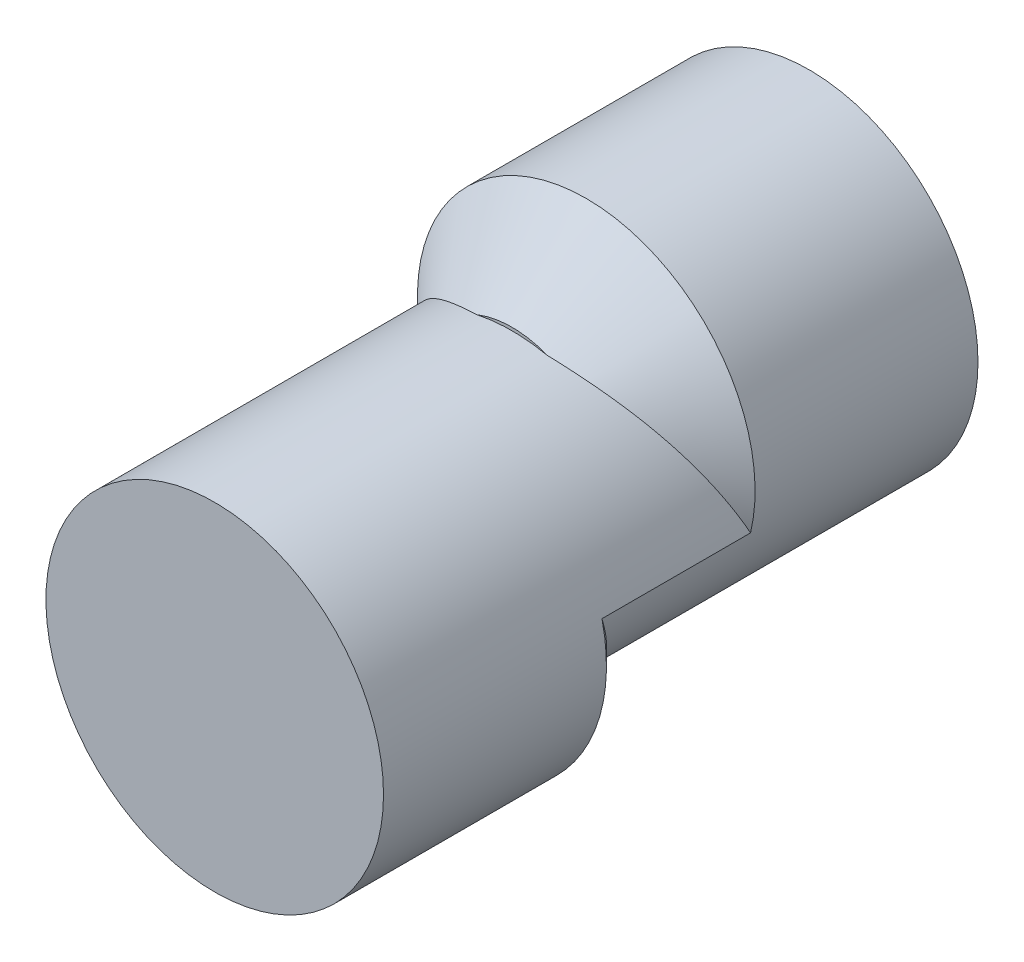
ISO-10303-21;
HEADER;
FILE_DESCRIPTION(('STEP AP214'),'2;1');
FILE_NAME('part.step','',(''),(''),'','','');
FILE_SCHEMA(('AUTOMOTIVE_DESIGN { 1 0 10303 214 1 1 1 1 }'));
ENDSEC;
DATA;
#1=APPLICATION_CONTEXT('core data for automotive mechanical design processes');
#2=APPLICATION_PROTOCOL_DEFINITION('international standard','automotive_design',2000,#1);
#3=PRODUCT_CONTEXT('',#1,'mechanical');
#4=PRODUCT('Part','Part','',(#3));
#5=PRODUCT_RELATED_PRODUCT_CATEGORY('part','',(#4));
#6=PRODUCT_DEFINITION_FORMATION('','',#4);
#7=PRODUCT_DEFINITION_CONTEXT('part definition',#1,'design');
#8=PRODUCT_DEFINITION('design','',#6,#7);
#9=PRODUCT_DEFINITION_SHAPE('','',#8);
#10=(LENGTH_UNIT() NAMED_UNIT(*) SI_UNIT(.MILLI.,.METRE.));
#11=(NAMED_UNIT(*) PLANE_ANGLE_UNIT() SI_UNIT($,.RADIAN.));
#12=(NAMED_UNIT(*) SI_UNIT($,.STERADIAN.) SOLID_ANGLE_UNIT());
#13=UNCERTAINTY_MEASURE_WITH_UNIT(LENGTH_MEASURE(1.E-05),#10,'distance_accuracy_value','');
#14=(GEOMETRIC_REPRESENTATION_CONTEXT(3) GLOBAL_UNCERTAINTY_ASSIGNED_CONTEXT((#13)) GLOBAL_UNIT_ASSIGNED_CONTEXT((#10,
#11,#12)) REPRESENTATION_CONTEXT('',''));
#15=CARTESIAN_POINT('',(0.,0.,0.));
#16=DIRECTION('',(0.,0.,1.));
#17=DIRECTION('',(1.,0.,0.));
#18=AXIS2_PLACEMENT_3D('',#15,#16,#17);
#19=CARTESIAN_POINT('',(0.,0.822072072072072,7.));
#20=DIRECTION('',(0.,0.,-1.));
#21=DIRECTION('',(-1.,0.,0.));
#22=AXIS2_PLACEMENT_3D('',#19,#20,#21);
#23=CYLINDRICAL_SURFACE('',#22,3.975);
#24=CARTESIAN_POINT('',(0.,0.822072072072072,7.));
#25=DIRECTION('',(0.,0.,1.));
#26=DIRECTION('',(1.,0.,0.));
#27=AXIS2_PLACEMENT_3D('',#24,#25,#26);
#28=CIRCLE('',#27,3.975);
#29=CARTESIAN_POINT('',(-0.825136211854354,-3.06634344480452,7.));
#30=VERTEX_POINT('',#29);
#31=CARTESIAN_POINT('',(0.825136211854354,-3.06634344480452,7.));
#32=VERTEX_POINT('',#31);
#33=EDGE_CURVE('E126',#30,#32,#28,.T.);
#34=ORIENTED_EDGE('',*,*,#33,.F.);
#35=CARTESIAN_POINT('',(-0.825136211854356,-3.06634344480452,7.));
#36=CARTESIAN_POINT('',(-0.920186670816375,-3.04617668217066,7.01651067742741));
#37=CARTESIAN_POINT('',(-1.0139871626504,-3.02262610696052,7.03561664821404));
#38=CARTESIAN_POINT('',(-1.19859074823412,-2.96913172623686,7.07833247271241));
#39=CARTESIAN_POINT('',(-1.28939687542998,-2.93919463564096,7.10193759316659));
#40=CARTESIAN_POINT('',(-1.55586430724988,-2.84066291568756,7.17824562838845));
#41=CARTESIAN_POINT('',(-1.72665856702912,-2.7631114475616,7.23664327167));
#42=CARTESIAN_POINT('',(-2.06011258229001,-2.58294765889725,7.36664062979916));
#43=CARTESIAN_POINT('',(-2.22204039744711,-2.47934938471252,7.43872287030837));
#44=CARTESIAN_POINT('',(-2.52757379104895,-2.25174491214059,7.59011924875008));
#45=CARTESIAN_POINT('',(-2.67114009019114,-2.12769622096309,7.66944828805433));
#46=CARTESIAN_POINT('',(-2.96528819345168,-1.83482006446246,7.84876720058461));
#47=CARTESIAN_POINT('',(-3.11136204896573,-1.66201616983082,7.94967857366983));
#48=CARTESIAN_POINT('',(-3.37167884066176,-1.29521783694176,8.15365004888719));
#49=CARTESIAN_POINT('',(-3.48594191569799,-1.101236914292,8.25670874695691));
#50=CARTESIAN_POINT('',(-3.64514303007103,-0.76982275853584,8.42517920554612));
#51=CARTESIAN_POINT('',(-3.70021820915196,-0.637244938342648,8.49075548996418));
#52=CARTESIAN_POINT('',(-3.79575268615637,-0.366802825007996,8.62108955056509));
#53=CARTESIAN_POINT('',(-3.83623327539684,-0.228946560013474,8.68584838500207));
#54=CARTESIAN_POINT('',(-3.86919091555893,-0.088963963963964,8.75));
#55=B_SPLINE_CURVE_WITH_KNOTS('',3,(#35,#36,#37,#38,#39,#40,#41,#42,#43,#44,#45,#46,#47,#48,#49,
#50,#51,#52,#53,#54),.UNSPECIFIED.,.F.,.F.,(4,2,2,2,2,2,2,2,2,4),(0.,0.295446494699376,
0.590583868366542,1.1775168786132,1.79135893638651,2.40649292135074,3.14668936861706,
3.88641613916092,4.35919599411835,4.83128331637747),.UNSPECIFIED.);
#56=CARTESIAN_POINT('',(-3.86919091555893,-0.0889639639639638,8.75));
#57=VERTEX_POINT('',#56);
#58=EDGE_CURVE('E11',#30,#57,#55,.T.);
#59=ORIENTED_EDGE('',*,*,#58,.T.);
#60=DIRECTION('',(0.,0.,-1.));
#61=VECTOR('',#60,1.);
#62=CARTESIAN_POINT('',(-3.86919091555893,-0.0889639639639638,7.));
#63=LINE('',#62,#61);
#64=CARTESIAN_POINT('',(-3.86919091555893,-0.0889639639639638,5.25));
#65=VERTEX_POINT('',#64);
#66=EDGE_CURVE('E138',#57,#65,#63,.T.);
#67=ORIENTED_EDGE('',*,*,#66,.T.);
#68=CARTESIAN_POINT('',(0.,0.822072072072072,5.25));
#69=DIRECTION('',(0.,0.,1.));
#70=DIRECTION('',(1.,0.,0.));
#71=AXIS2_PLACEMENT_3D('',#68,#69,#70);
#72=CIRCLE('',#71,3.975);
#73=CARTESIAN_POINT('',(3.86919091555893,-0.0889639639639638,5.25));
#74=VERTEX_POINT('',#73);
#75=EDGE_CURVE('E135',#65,#74,#72,.F.);
#76=ORIENTED_EDGE('',*,*,#75,.T.);
#77=DIRECTION('',(0.,0.,-1.));
#78=VECTOR('',#77,1.);
#79=CARTESIAN_POINT('',(3.86919091555893,-0.0889639639639638,5.25));
#80=LINE('',#79,#78);
#81=CARTESIAN_POINT('',(3.86919091555893,-0.0889639639639638,8.75));
#82=VERTEX_POINT('',#81);
#83=EDGE_CURVE('E133',#74,#82,#80,.F.);
#84=ORIENTED_EDGE('',*,*,#83,.T.);
#85=CARTESIAN_POINT('',(3.86919091555893,-0.0889639639639638,8.75));
#86=CARTESIAN_POINT('',(3.84100612720871,-0.208638105703234,8.6951469272122));
#87=CARTESIAN_POINT('',(3.80734023640044,-0.326744579237202,8.6398681262106));
#88=CARTESIAN_POINT('',(3.72934889975285,-0.559094846938218,8.52872996749619));
#89=CARTESIAN_POINT('',(3.68502398749053,-0.673338834129987,8.47287063897771));
#90=CARTESIAN_POINT('',(3.53644387056577,-1.00935252841304,8.30474550866237));
#91=CARTESIAN_POINT('',(3.41662147895167,-1.2242432319837,8.19200606803454));
#92=CARTESIAN_POINT('',(3.13884595505653,-1.62920609564625,7.96878274734657));
#93=CARTESIAN_POINT('',(2.98085914136252,-1.81925610337816,7.85830095367156));
#94=CARTESIAN_POINT('',(2.62983756498367,-2.168880157,7.6442281973571));
#95=CARTESIAN_POINT('',(2.43681371473362,-2.32846366015003,7.54063510289045));
#96=CARTESIAN_POINT('',(2.14550823621066,-2.52568137749763,7.40604203406273));
#97=CARTESIAN_POINT('',(2.06022976589145,-2.57885181689392,7.36891589185173));
#98=CARTESIAN_POINT('',(1.88492959394323,-2.67904849143995,7.29754741728103));
#99=CARTESIAN_POINT('',(1.79490759505859,-2.72607434089175,7.26330526599831));
#100=CARTESIAN_POINT('',(1.61074832852978,-2.81337447403378,7.19853655711195));
#101=CARTESIAN_POINT('',(1.51662496198956,-2.85366962023959,7.1679986017063));
#102=CARTESIAN_POINT('',(1.32442121372671,-2.92720856851457,7.11133361695063));
#103=CARTESIAN_POINT('',(1.22634359587661,-2.96045719751652,7.08520357065983));
#104=CARTESIAN_POINT('',(1.07711091202107,-3.00456070298598,7.05006186065333));
#105=CARTESIAN_POINT('',(1.02724231713216,-3.01825160154244,7.03906391631313));
#106=CARTESIAN_POINT('',(0.926743620304455,-3.04373421405,7.01846199151866));
#107=CARTESIAN_POINT('',(0.876113590136417,-3.05552610578459,7.00885788058317));
#108=CARTESIAN_POINT('',(0.825136211854359,-3.06634344480452,6.99999999999999));
#109=B_SPLINE_CURVE_WITH_KNOTS('',3,(#85,#86,#87,#88,#89,#90,#91,#92,#93,#94,#95,#96,#97,#98,
#99,#100,#101,#102,#103,#104,#105,#106,#107,#108),.UNSPECIFIED.,.F.,.F.,(4,2,2,2,2,2,2,2,2,2,2,
4),(0.,0.403626287271086,0.807232373730234,1.61498019230411,2.42344349729075,3.23165543363087,
3.55282305806935,3.87401083263157,4.19418379569483,4.51413672316423,4.67269702010517,
4.83124246411816),.UNSPECIFIED.);
#110=EDGE_CURVE('E50',#82,#32,#109,.T.);
#111=ORIENTED_EDGE('',*,*,#110,.T.);
#112=EDGE_LOOP('',(#34,#59,#67,#76,#84,#111));
#113=FACE_BOUND('',#112,.T.);
#114=CARTESIAN_POINT('',(0.,0.822072072072072,0.));
#115=DIRECTION('',(0.,0.,1.));
#116=DIRECTION('',(1.,0.,0.));
#117=AXIS2_PLACEMENT_3D('',#114,#115,#116);
#118=CIRCLE('',#117,3.975);
#119=CARTESIAN_POINT('',(3.975,0.822072072072072,0.));
#120=VERTEX_POINT('',#119);
#121=EDGE_CURVE('E123',#120,#120,#118,.T.);
#122=ORIENTED_EDGE('',*,*,#121,.T.);
#123=EDGE_LOOP('',(#122));
#124=FACE_BOUND('',#123,.T.);
#125=ADVANCED_FACE('F35',(#113,#124),#23,.T.);
#126=CARTESIAN_POINT('',(0.,0.822072072072072,7.));
#127=DIRECTION('',(0.,0.,1.));
#128=DIRECTION('',(1.,0.,0.));
#129=AXIS2_PLACEMENT_3D('',#126,#127,#128);
#130=PLANE('',#129);
#131=CARTESIAN_POINT('',(0.,-1.,7.));
#132=DIRECTION('',(0.,0.,1.));
#133=DIRECTION('',(1.,0.,0.));
#134=AXIS2_PLACEMENT_3D('',#131,#132,#133);
#135=CIRCLE('',#134,3.975);
#136=CARTESIAN_POINT('',(0.825136211854414,2.88841551687658,7.));
#137=VERTEX_POINT('',#136);
#138=CARTESIAN_POINT('',(-0.825136211854414,2.88841551687658,7.));
#139=VERTEX_POINT('',#138);
#140=EDGE_CURVE('E118',#137,#139,#135,.T.);
#141=ORIENTED_EDGE('',*,*,#140,.F.);
#142=CARTESIAN_POINT('',(0.,0.822072072072072,7.));
#143=DIRECTION('',(0.,0.,1.));
#144=DIRECTION('',(1.,0.,0.));
#145=AXIS2_PLACEMENT_3D('',#142,#143,#144);
#146=CIRCLE('',#145,2.225);
#147=EDGE_CURVE('E128',#137,#139,#146,.T.);
#148=ORIENTED_EDGE('',*,*,#147,.T.);
#149=EDGE_LOOP('',(#141,#148));
#150=FACE_BOUND('',#149,.T.);
#151=ADVANCED_FACE('F170',(#150),#130,.T.);
#152=CARTESIAN_POINT('',(0.,0.822072072072072,0.));
#153=DIRECTION('',(0.,0.,1.));
#154=DIRECTION('',(1.,0.,0.));
#155=AXIS2_PLACEMENT_3D('',#152,#153,#154);
#156=PLANE('',#155);
#157=DIRECTION('',(-1.,0.,0.));
#158=VECTOR('',#157,1.);
#159=CARTESIAN_POINT('',(-1.53297097167559,2.1,0.));
#160=LINE('',#159,#158);
#161=CARTESIAN_POINT('',(1.53297097167559,2.1,0.));
#162=VERTEX_POINT('',#161);
#163=CARTESIAN_POINT('',(-1.53297097167559,2.1,0.));
#164=VERTEX_POINT('',#163);
#165=EDGE_CURVE('E105',#162,#164,#160,.T.);
#166=ORIENTED_EDGE('',*,*,#165,.T.);
#167=CARTESIAN_POINT('',(0.,0.,0.));
#168=DIRECTION('',(0.,0.,1.));
#169=DIRECTION('',(1.,0.,0.));
#170=AXIS2_PLACEMENT_3D('',#167,#168,#169);
#171=CIRCLE('',#170,2.6);
#172=EDGE_CURVE('E97',#164,#162,#171,.T.);
#173=ORIENTED_EDGE('',*,*,#172,.T.);
#174=EDGE_LOOP('',(#166,#173));
#175=FACE_BOUND('',#174,.T.);
#176=ORIENTED_EDGE('',*,*,#121,.F.);
#177=EDGE_LOOP('',(#176));
#178=FACE_BOUND('',#177,.T.);
#179=ADVANCED_FACE('F111',(#175,#178),#156,.F.);
#180=CARTESIAN_POINT('',(0.,-1.,7.));
#181=DIRECTION('',(0.,0.,1.));
#182=DIRECTION('',(1.,0.,0.));
#183=AXIS2_PLACEMENT_3D('',#180,#181,#182);
#184=PLANE('',#183);
#185=ORIENTED_EDGE('',*,*,#33,.T.);
#186=CARTESIAN_POINT('',(0.,-1.,7.));
#187=DIRECTION('',(0.,0.,1.));
#188=DIRECTION('',(1.,0.,0.));
#189=AXIS2_PLACEMENT_3D('',#186,#187,#188);
#190=CIRCLE('',#189,2.22499999999999);
#191=EDGE_CURVE('E62',#32,#30,#190,.F.);
#192=ORIENTED_EDGE('',*,*,#191,.T.);
#193=EDGE_LOOP('',(#185,#192));
#194=FACE_BOUND('',#193,.T.);
#195=ADVANCED_FACE('F232',(#194),#184,.F.);
#196=CARTESIAN_POINT('',(0.,-1.,14.));
#197=DIRECTION('',(0.,0.,-1.));
#198=DIRECTION('',(-1.,0.,0.));
#199=AXIS2_PLACEMENT_3D('',#196,#197,#198);
#200=CYLINDRICAL_SURFACE('',#199,3.975);
#201=CARTESIAN_POINT('',(0.,-1.,14.));
#202=DIRECTION('',(0.,0.,1.));
#203=DIRECTION('',(1.,0.,0.));
#204=AXIS2_PLACEMENT_3D('',#201,#202,#203);
#205=CIRCLE('',#204,3.975);
#206=CARTESIAN_POINT('',(3.975,-1.,14.));
#207=VERTEX_POINT('',#206);
#208=EDGE_CURVE('E120',#207,#207,#205,.T.);
#209=ORIENTED_EDGE('',*,*,#208,.F.);
#210=EDGE_LOOP('',(#209));
#211=FACE_BOUND('',#210,.T.);
#212=CARTESIAN_POINT('',(0.,-1.,8.75));
#213=DIRECTION('',(0.,0.,1.));
#214=DIRECTION('',(1.,0.,0.));
#215=AXIS2_PLACEMENT_3D('',#212,#213,#214);
#216=CIRCLE('',#215,3.975);
#217=EDGE_CURVE('E177',#57,#82,#216,.T.);
#218=ORIENTED_EDGE('',*,*,#217,.T.);
#219=ORIENTED_EDGE('',*,*,#83,.F.);
#220=CARTESIAN_POINT('',(3.86919091555893,-0.0889639639639638,5.25));
#221=CARTESIAN_POINT('',(3.84100612720871,0.0307101777753053,5.30485307278781));
#222=CARTESIAN_POINT('',(3.80734023640044,0.148816651309273,5.3601318737894));
#223=CARTESIAN_POINT('',(3.72934889975285,0.381166919010289,5.47127003250382));
#224=CARTESIAN_POINT('',(3.68502398749053,0.495410906202059,5.52712936102229));
#225=CARTESIAN_POINT('',(3.53644387056577,0.831424600485115,5.69525449133764));
#226=CARTESIAN_POINT('',(3.41662147895167,1.04631530405577,5.80799393196546));
#227=CARTESIAN_POINT('',(3.13884595505652,1.45127816771832,6.03121725265343));
#228=CARTESIAN_POINT('',(2.98085914136252,1.64132817545023,6.14169904632845));
#229=CARTESIAN_POINT('',(2.62983756498367,1.99095222907208,6.35577180264291));
#230=CARTESIAN_POINT('',(2.43681371473362,2.15053573222211,6.45936489710955));
#231=CARTESIAN_POINT('',(2.14550823621065,2.34775344956971,6.59395796593728));
#232=CARTESIAN_POINT('',(2.06022976589144,2.40092388896599,6.63108410814829));
#233=CARTESIAN_POINT('',(1.88492959394323,2.50112056351203,6.70245258271898));
#234=CARTESIAN_POINT('',(1.79490759505859,2.54814641296383,6.7366947340017));
#235=CARTESIAN_POINT('',(1.61074832852977,2.63544654610586,6.80146344288806));
#236=CARTESIAN_POINT('',(1.51662496198955,2.67574169231167,6.83200139829371));
#237=CARTESIAN_POINT('',(1.3244212137267,2.74928064058664,6.88866638304938));
#238=CARTESIAN_POINT('',(1.22634359587661,2.7825292695886,6.91479642934018));
#239=CARTESIAN_POINT('',(1.07711091202108,2.82663277505806,6.94993813934668));
#240=CARTESIAN_POINT('',(1.02724231713218,2.84032367361451,6.96093608368688));
#241=CARTESIAN_POINT('',(0.92674362030449,2.86580628612206,6.98153800848134));
#242=CARTESIAN_POINT('',(0.876113590136463,2.87759817785665,6.99114211941683));
#243=CARTESIAN_POINT('',(0.825136211854417,2.88841551687658,7.00000000000001));
#244=B_SPLINE_CURVE_WITH_KNOTS('',3,(#220,#221,#222,#223,#224,#225,#226,#227,#228,#229,#230,
#231,#232,#233,#234,#235,#236,#237,#238,#239,#240,#241,#242,#243),.UNSPECIFIED.,.F.,.F.,(4,2,2,
2,2,2,2,2,2,2,2,4),(0.,0.403626287271085,0.807232373730234,1.61498019230411,2.42344349729076,
3.23165543363088,3.55282305806936,3.87401083263158,4.19418379569484,4.51413672316424,
4.67269702010515,4.8312424641181),.UNSPECIFIED.);
#245=EDGE_CURVE('E148',#74,#137,#244,.T.);
#246=ORIENTED_EDGE('',*,*,#245,.T.);
#247=ORIENTED_EDGE('',*,*,#140,.T.);
#248=CARTESIAN_POINT('',(-0.825136211854414,2.88841551687658,7.));
#249=CARTESIAN_POINT('',(-0.920186670816434,2.86824875424271,6.98348932257259));
#250=CARTESIAN_POINT('',(-1.01398716265046,2.84469817903258,6.96438335178596));
#251=CARTESIAN_POINT('',(-1.19859074823418,2.79120379830891,6.92166752728758));
#252=CARTESIAN_POINT('',(-1.28939687543004,2.76126670771301,6.8980624068334));
#253=CARTESIAN_POINT('',(-1.55586430724995,2.66273498775961,6.82175437161154));
#254=CARTESIAN_POINT('',(-1.72665856702918,2.58518351963364,6.76335672832998));
#255=CARTESIAN_POINT('',(-2.06011258229007,2.40501973096929,6.63335937020082));
#256=CARTESIAN_POINT('',(-2.22204039744717,2.30142145678455,6.56127712969162));
#257=CARTESIAN_POINT('',(-2.52757379104901,2.07381698421261,6.4098807512499));
#258=CARTESIAN_POINT('',(-2.67114009019119,1.94976829303511,6.33055171194565));
#259=CARTESIAN_POINT('',(-2.96528819345174,1.65689213653447,6.15123279941536));
#260=CARTESIAN_POINT('',(-3.11136204896578,1.48408824190282,6.05032142633014));
#261=CARTESIAN_POINT('',(-3.3716788406618,1.11728990901376,5.84634995111278));
#262=CARTESIAN_POINT('',(-3.48594191569803,0.923308986363998,5.74329125304305));
#263=CARTESIAN_POINT('',(-3.64514303007106,0.591894830607843,5.57482079445386));
#264=CARTESIAN_POINT('',(-3.70021820915198,0.459317010414664,5.50924451003579));
#265=CARTESIAN_POINT('',(-3.79575268615638,0.188874897080039,5.3789104494349));
#266=CARTESIAN_POINT('',(-3.83623327539685,0.0510186320855315,5.31415161499792));
#267=CARTESIAN_POINT('',(-3.86919091555893,-0.0889639639639644,5.25));
#268=B_SPLINE_CURVE_WITH_KNOTS('',3,(#248,#249,#250,#251,#252,#253,#254,#255,#256,#257,#258,
#259,#260,#261,#262,#263,#264,#265,#266,#267),.UNSPECIFIED.,.F.,.F.,(4,2,2,2,2,2,2,2,2,4),(0.,
0.29544649469938,0.59058386836655,1.17751687861321,1.79135893638653,2.40649292135077,
3.1466893686171,3.88641613916096,4.35919599411834,4.83128331637741),.UNSPECIFIED.);
#269=EDGE_CURVE('E141',#139,#65,#268,.T.);
#270=ORIENTED_EDGE('',*,*,#269,.T.);
#271=ORIENTED_EDGE('',*,*,#66,.F.);
#272=EDGE_LOOP('',(#218,#219,#246,#247,#270,#271));
#273=FACE_BOUND('',#272,.T.);
#274=ADVANCED_FACE('F154',(#211,#273),#200,.T.);
#275=CARTESIAN_POINT('',(0.,-1.,14.));
#276=DIRECTION('',(0.,0.,1.));
#277=DIRECTION('',(1.,0.,0.));
#278=AXIS2_PLACEMENT_3D('',#275,#276,#277);
#279=PLANE('',#278);
#280=ORIENTED_EDGE('',*,*,#208,.T.);
#281=EDGE_LOOP('',(#280));
#282=FACE_BOUND('',#281,.T.);
#283=ADVANCED_FACE('F218',(#282),#279,.T.);
#284=CARTESIAN_POINT('',(0.,0.,0.));
#285=DIRECTION('',(0.,0.,1.));
#286=DIRECTION('',(1.,0.,0.));
#287=AXIS2_PLACEMENT_3D('',#284,#285,#286);
#288=CYLINDRICAL_SURFACE('',#287,2.6);
#289=CARTESIAN_POINT('',(0.,0.,12.));
#290=DIRECTION('',(0.,0.,1.));
#291=DIRECTION('',(1.,0.,0.));
#292=AXIS2_PLACEMENT_3D('',#289,#290,#291);
#293=CIRCLE('',#292,2.6);
#294=CARTESIAN_POINT('',(-1.53297097167559,2.1,12.));
#295=VERTEX_POINT('',#294);
#296=CARTESIAN_POINT('',(1.53297097167559,2.1,12.));
#297=VERTEX_POINT('',#296);
#298=EDGE_CURVE('E100',#295,#297,#293,.T.);
#299=ORIENTED_EDGE('',*,*,#298,.T.);
#300=DIRECTION('',(0.,0.,1.));
#301=VECTOR('',#300,1.);
#302=CARTESIAN_POINT('',(1.53297097167559,2.1,0.));
#303=LINE('',#302,#301);
#304=EDGE_CURVE('E93',#162,#297,#303,.T.);
#305=ORIENTED_EDGE('',*,*,#304,.F.);
#306=ORIENTED_EDGE('',*,*,#172,.F.);
#307=DIRECTION('',(0.,0.,1.));
#308=VECTOR('',#307,1.);
#309=CARTESIAN_POINT('',(-1.53297097167559,2.1,0.));
#310=LINE('',#309,#308);
#311=EDGE_CURVE('E104',#164,#295,#310,.T.);
#312=ORIENTED_EDGE('',*,*,#311,.T.);
#313=EDGE_LOOP('',(#299,#305,#306,#312));
#314=FACE_BOUND('',#313,.T.);
#315=ADVANCED_FACE('F95',(#314),#288,.F.);
#316=CARTESIAN_POINT('',(-1.53297097167559,2.1,0.));
#317=DIRECTION('',(0.,1.,0.));
#318=DIRECTION('',(0.,0.,1.));
#319=AXIS2_PLACEMENT_3D('',#316,#317,#318);
#320=PLANE('',#319);
#321=DIRECTION('',(-1.,0.,0.));
#322=VECTOR('',#321,1.);
#323=CARTESIAN_POINT('',(-1.53297097167559,2.1,12.));
#324=LINE('',#323,#322);
#325=EDGE_CURVE('E113',#297,#295,#324,.T.);
#326=ORIENTED_EDGE('',*,*,#325,.T.);
#327=ORIENTED_EDGE('',*,*,#311,.F.);
#328=ORIENTED_EDGE('',*,*,#165,.F.);
#329=ORIENTED_EDGE('',*,*,#304,.T.);
#330=EDGE_LOOP('',(#326,#327,#328,#329));
#331=FACE_BOUND('',#330,.T.);
#332=ADVANCED_FACE('F108',(#331),#320,.F.);
#333=CARTESIAN_POINT('',(0.,0.,12.));
#334=DIRECTION('',(0.,0.,1.));
#335=DIRECTION('',(1.,0.,0.));
#336=AXIS2_PLACEMENT_3D('',#333,#334,#335);
#337=PLANE('',#336);
#338=ORIENTED_EDGE('',*,*,#298,.F.);
#339=ORIENTED_EDGE('',*,*,#325,.F.);
#340=EDGE_LOOP('',(#338,#339));
#341=FACE_BOUND('',#340,.T.);
#342=ADVANCED_FACE('F164',(#341),#337,.F.);
#343=CARTESIAN_POINT('',(0.,0.822072072072072,7.));
#344=DIRECTION('',(0.,0.,-1.));
#345=DIRECTION('',(-1.,0.,0.));
#346=AXIS2_PLACEMENT_3D('',#343,#344,#345);
#347=CONICAL_SURFACE('',#346,2.225,0.785398163397447);
#348=ORIENTED_EDGE('',*,*,#245,.F.);
#349=ORIENTED_EDGE('',*,*,#75,.F.);
#350=ORIENTED_EDGE('',*,*,#269,.F.);
#351=ORIENTED_EDGE('',*,*,#147,.F.);
#352=EDGE_LOOP('',(#348,#349,#350,#351));
#353=FACE_BOUND('',#352,.T.);
#354=ADVANCED_FACE('F159',(#353),#347,.T.);
#355=CARTESIAN_POINT('',(0.,-1.,8.75));
#356=DIRECTION('',(0.,0.,1.));
#357=DIRECTION('',(1.,0.,0.));
#358=AXIS2_PLACEMENT_3D('',#355,#356,#357);
#359=CONICAL_SURFACE('',#358,3.975,0.78539816339745);
#360=ORIENTED_EDGE('',*,*,#58,.F.);
#361=ORIENTED_EDGE('',*,*,#191,.F.);
#362=ORIENTED_EDGE('',*,*,#110,.F.);
#363=ORIENTED_EDGE('',*,*,#217,.F.);
#364=EDGE_LOOP('',(#360,#361,#362,#363));
#365=FACE_BOUND('',#364,.T.);
#366=ADVANCED_FACE('F38',(#365),#359,.T.);
#367=CLOSED_SHELL('',(#125,#151,#179,#195,#274,#283,#315,#332,#342,#354,#366));
#368=MANIFOLD_SOLID_BREP('B2',#367);
#369=ADVANCED_BREP_SHAPE_REPRESENTATION('',(#18,#368),#14);
#370=SHAPE_DEFINITION_REPRESENTATION(#9,#369);
ENDSEC;
END-ISO-10303-21;
